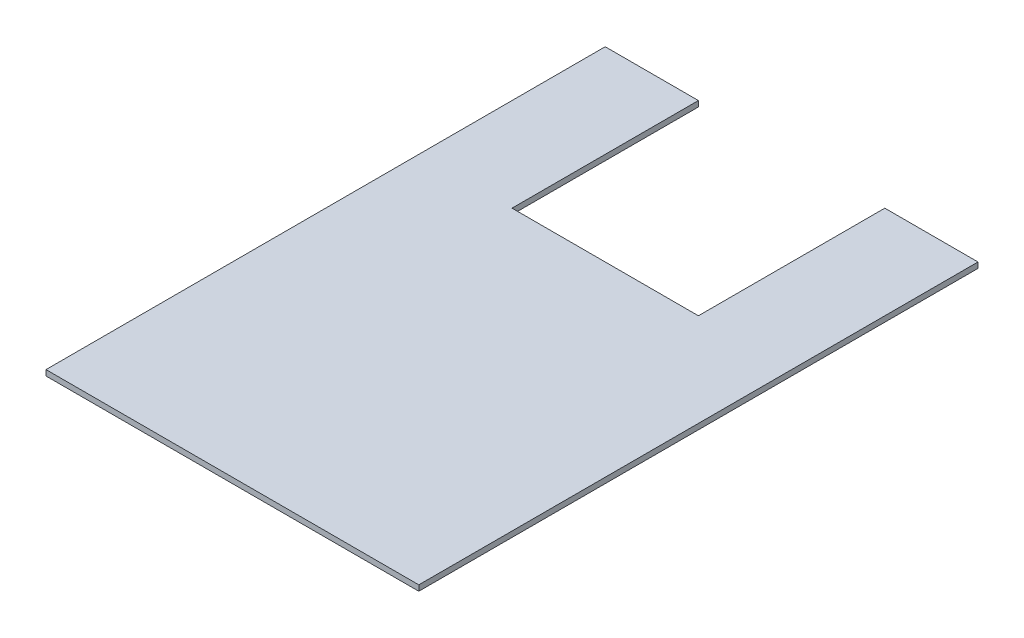
ISO-10303-21;
HEADER;
FILE_DESCRIPTION(('STEP AP214'),'2;1');
FILE_NAME('part.step','',(''),(''),'','','');
FILE_SCHEMA(('AUTOMOTIVE_DESIGN { 1 0 10303 214 1 1 1 1 }'));
ENDSEC;
DATA;
#1=APPLICATION_CONTEXT('core data for automotive mechanical design processes');
#2=APPLICATION_PROTOCOL_DEFINITION('international standard','automotive_design',2000,#1);
#3=PRODUCT_CONTEXT('',#1,'mechanical');
#4=PRODUCT('Part','Part','',(#3));
#5=PRODUCT_RELATED_PRODUCT_CATEGORY('part','',(#4));
#6=PRODUCT_DEFINITION_FORMATION('','',#4);
#7=PRODUCT_DEFINITION_CONTEXT('part definition',#1,'design');
#8=PRODUCT_DEFINITION('design','',#6,#7);
#9=PRODUCT_DEFINITION_SHAPE('','',#8);
#10=(LENGTH_UNIT() NAMED_UNIT(*) SI_UNIT(.MILLI.,.METRE.));
#11=(NAMED_UNIT(*) PLANE_ANGLE_UNIT() SI_UNIT($,.RADIAN.));
#12=(NAMED_UNIT(*) SI_UNIT($,.STERADIAN.) SOLID_ANGLE_UNIT());
#13=UNCERTAINTY_MEASURE_WITH_UNIT(LENGTH_MEASURE(1.E-05),#10,'distance_accuracy_value','');
#14=(GEOMETRIC_REPRESENTATION_CONTEXT(3) GLOBAL_UNCERTAINTY_ASSIGNED_CONTEXT((#13)) GLOBAL_UNIT_ASSIGNED_CONTEXT((#10,
#11,#12)) REPRESENTATION_CONTEXT('',''));
#15=CARTESIAN_POINT('',(0.,0.,0.));
#16=DIRECTION('',(0.,0.,1.));
#17=DIRECTION('',(1.,0.,0.));
#18=AXIS2_PLACEMENT_3D('',#15,#16,#17);
#19=CARTESIAN_POINT('',(-100.,3.,-150.));
#20=DIRECTION('',(0.,0.,1.));
#21=DIRECTION('',(1.,0.,0.));
#22=AXIS2_PLACEMENT_3D('',#19,#20,#21);
#23=PLANE('',#22);
#24=DIRECTION('',(0.,1.,0.));
#25=VECTOR('',#24,1.);
#26=CARTESIAN_POINT('',(50.,0.,-150.));
#27=LINE('',#26,#25);
#28=CARTESIAN_POINT('',(50.,0.,-150.));
#29=VERTEX_POINT('',#28);
#30=CARTESIAN_POINT('',(50.,3.,-150.));
#31=VERTEX_POINT('',#30);
#32=EDGE_CURVE('E107',#29,#31,#27,.T.);
#33=ORIENTED_EDGE('',*,*,#32,.T.);
#34=DIRECTION('',(-1.,0.,0.));
#35=VECTOR('',#34,1.);
#36=CARTESIAN_POINT('',(-100.,3.,-150.));
#37=LINE('',#36,#35);
#38=CARTESIAN_POINT('',(100.,3.,-150.));
#39=VERTEX_POINT('',#38);
#40=EDGE_CURVE('E86',#39,#31,#37,.T.);
#41=ORIENTED_EDGE('',*,*,#40,.F.);
#42=DIRECTION('',(0.,-1.,0.));
#43=VECTOR('',#42,1.);
#44=CARTESIAN_POINT('',(100.,3.,-150.));
#45=LINE('',#44,#43);
#46=CARTESIAN_POINT('',(100.,0.,-150.));
#47=VERTEX_POINT('',#46);
#48=EDGE_CURVE('E11',#39,#47,#45,.T.);
#49=ORIENTED_EDGE('',*,*,#48,.T.);
#50=DIRECTION('',(-1.,0.,0.));
#51=VECTOR('',#50,1.);
#52=CARTESIAN_POINT('',(-100.,0.,-150.));
#53=LINE('',#52,#51);
#54=EDGE_CURVE('E122',#47,#29,#53,.T.);
#55=ORIENTED_EDGE('',*,*,#54,.T.);
#56=EDGE_LOOP('',(#33,#41,#49,#55));
#57=FACE_BOUND('',#56,.T.);
#58=ADVANCED_FACE('F34',(#57),#23,.F.);
#59=DIRECTION('',(0.,1.,0.));
#60=VECTOR('',#59,1.);
#61=CARTESIAN_POINT('',(-50.,0.,-150.));
#62=LINE('',#61,#60);
#63=CARTESIAN_POINT('',(-50.,0.,-150.));
#64=VERTEX_POINT('',#63);
#65=CARTESIAN_POINT('',(-50.,3.,-150.));
#66=VERTEX_POINT('',#65);
#67=EDGE_CURVE('E162',#64,#66,#62,.T.);
#68=ORIENTED_EDGE('',*,*,#67,.F.);
#69=CARTESIAN_POINT('',(-100.,0.,-150.));
#70=VERTEX_POINT('',#69);
#71=EDGE_CURVE('E130',#64,#70,#53,.T.);
#72=ORIENTED_EDGE('',*,*,#71,.T.);
#73=DIRECTION('',(0.,-1.,0.));
#74=VECTOR('',#73,1.);
#75=CARTESIAN_POINT('',(-100.,3.,-150.));
#76=LINE('',#75,#74);
#77=CARTESIAN_POINT('',(-100.,3.,-150.));
#78=VERTEX_POINT('',#77);
#79=EDGE_CURVE('E42',#78,#70,#76,.T.);
#80=ORIENTED_EDGE('',*,*,#79,.F.);
#81=EDGE_CURVE('E158',#66,#78,#37,.T.);
#82=ORIENTED_EDGE('',*,*,#81,.F.);
#83=EDGE_LOOP('',(#68,#72,#80,#82));
#84=FACE_BOUND('',#83,.T.);
#85=ADVANCED_FACE('F177',(#84),#23,.F.);
#86=CARTESIAN_POINT('',(0.,3.,0.));
#87=DIRECTION('',(0.,1.,0.));
#88=DIRECTION('',(0.,0.,1.));
#89=AXIS2_PLACEMENT_3D('',#86,#87,#88);
#90=PLANE('',#89);
#91=ORIENTED_EDGE('',*,*,#40,.T.);
#92=DIRECTION('',(0.,0.,1.));
#93=VECTOR('',#92,1.);
#94=CARTESIAN_POINT('',(50.,3.,-150.));
#95=LINE('',#94,#93);
#96=CARTESIAN_POINT('',(50.,3.,-50.0000000000001));
#97=VERTEX_POINT('',#96);
#98=EDGE_CURVE('E113',#31,#97,#95,.T.);
#99=ORIENTED_EDGE('',*,*,#98,.T.);
#100=DIRECTION('',(-1.,0.,0.));
#101=VECTOR('',#100,1.);
#102=CARTESIAN_POINT('',(50.,3.,-50.0000000000001));
#103=LINE('',#102,#101);
#104=CARTESIAN_POINT('',(-50.,3.,-50.0000000000001));
#105=VERTEX_POINT('',#104);
#106=EDGE_CURVE('E167',#97,#105,#103,.T.);
#107=ORIENTED_EDGE('',*,*,#106,.T.);
#108=DIRECTION('',(0.,0.,-1.));
#109=VECTOR('',#108,1.);
#110=CARTESIAN_POINT('',(-50.,3.,-50.0000000000001));
#111=LINE('',#110,#109);
#112=EDGE_CURVE('E125',#105,#66,#111,.T.);
#113=ORIENTED_EDGE('',*,*,#112,.T.);
#114=ORIENTED_EDGE('',*,*,#81,.T.);
#115=DIRECTION('',(0.,0.,1.));
#116=VECTOR('',#115,1.);
#117=CARTESIAN_POINT('',(-100.,3.,-150.));
#118=LINE('',#117,#116);
#119=CARTESIAN_POINT('',(-100.,3.,150.));
#120=VERTEX_POINT('',#119);
#121=EDGE_CURVE('E148',#78,#120,#118,.T.);
#122=ORIENTED_EDGE('',*,*,#121,.T.);
#123=DIRECTION('',(1.,0.,0.));
#124=VECTOR('',#123,1.);
#125=CARTESIAN_POINT('',(-100.,3.,150.));
#126=LINE('',#125,#124);
#127=CARTESIAN_POINT('',(100.,3.,150.));
#128=VERTEX_POINT('',#127);
#129=EDGE_CURVE('E58',#120,#128,#126,.T.);
#130=ORIENTED_EDGE('',*,*,#129,.T.);
#131=DIRECTION('',(0.,0.,-1.));
#132=VECTOR('',#131,1.);
#133=CARTESIAN_POINT('',(100.,3.,-150.));
#134=LINE('',#133,#132);
#135=EDGE_CURVE('E137',#128,#39,#134,.T.);
#136=ORIENTED_EDGE('',*,*,#135,.T.);
#137=EDGE_LOOP('',(#91,#99,#107,#113,#114,#122,#130,#136));
#138=FACE_BOUND('',#137,.T.);
#139=ADVANCED_FACE('F178',(#138),#90,.T.);
#140=CARTESIAN_POINT('',(0.,0.,0.));
#141=DIRECTION('',(0.,1.,0.));
#142=DIRECTION('',(0.,0.,1.));
#143=AXIS2_PLACEMENT_3D('',#140,#141,#142);
#144=PLANE('',#143);
#145=DIRECTION('',(0.,0.,1.));
#146=VECTOR('',#145,1.);
#147=CARTESIAN_POINT('',(50.,0.,-150.));
#148=LINE('',#147,#146);
#149=CARTESIAN_POINT('',(50.,0.,-50.0000000000001));
#150=VERTEX_POINT('',#149);
#151=EDGE_CURVE('E110',#29,#150,#148,.T.);
#152=ORIENTED_EDGE('',*,*,#151,.F.);
#153=ORIENTED_EDGE('',*,*,#54,.F.);
#154=DIRECTION('',(0.,0.,-1.));
#155=VECTOR('',#154,1.);
#156=CARTESIAN_POINT('',(100.,0.,-150.));
#157=LINE('',#156,#155);
#158=CARTESIAN_POINT('',(100.,0.,150.));
#159=VERTEX_POINT('',#158);
#160=EDGE_CURVE('E115',#159,#47,#157,.T.);
#161=ORIENTED_EDGE('',*,*,#160,.F.);
#162=DIRECTION('',(1.,0.,0.));
#163=VECTOR('',#162,1.);
#164=CARTESIAN_POINT('',(-100.,0.,150.));
#165=LINE('',#164,#163);
#166=CARTESIAN_POINT('',(-100.,0.,150.));
#167=VERTEX_POINT('',#166);
#168=EDGE_CURVE('E79',#167,#159,#165,.T.);
#169=ORIENTED_EDGE('',*,*,#168,.F.);
#170=DIRECTION('',(0.,0.,1.));
#171=VECTOR('',#170,1.);
#172=CARTESIAN_POINT('',(-100.,0.,-150.));
#173=LINE('',#172,#171);
#174=EDGE_CURVE('E129',#70,#167,#173,.T.);
#175=ORIENTED_EDGE('',*,*,#174,.F.);
#176=ORIENTED_EDGE('',*,*,#71,.F.);
#177=DIRECTION('',(0.,0.,-1.));
#178=VECTOR('',#177,1.);
#179=CARTESIAN_POINT('',(-50.,0.,-50.0000000000001));
#180=LINE('',#179,#178);
#181=CARTESIAN_POINT('',(-50.,0.,-50.0000000000001));
#182=VERTEX_POINT('',#181);
#183=EDGE_CURVE('E164',#182,#64,#180,.T.);
#184=ORIENTED_EDGE('',*,*,#183,.F.);
#185=DIRECTION('',(-1.,0.,0.));
#186=VECTOR('',#185,1.);
#187=CARTESIAN_POINT('',(50.,0.,-50.0000000000001));
#188=LINE('',#187,#186);
#189=EDGE_CURVE('E124',#150,#182,#188,.T.);
#190=ORIENTED_EDGE('',*,*,#189,.F.);
#191=EDGE_LOOP('',(#152,#153,#161,#169,#175,#176,#184,#190));
#192=FACE_BOUND('',#191,.T.);
#193=ADVANCED_FACE('F120',(#192),#144,.F.);
#194=CARTESIAN_POINT('',(100.,3.,-150.));
#195=DIRECTION('',(-1.,0.,0.));
#196=DIRECTION('',(0.,0.,1.));
#197=AXIS2_PLACEMENT_3D('',#194,#195,#196);
#198=PLANE('',#197);
#199=ORIENTED_EDGE('',*,*,#160,.T.);
#200=ORIENTED_EDGE('',*,*,#48,.F.);
#201=ORIENTED_EDGE('',*,*,#135,.F.);
#202=DIRECTION('',(0.,-1.,0.));
#203=VECTOR('',#202,1.);
#204=CARTESIAN_POINT('',(100.,3.,150.));
#205=LINE('',#204,#203);
#206=EDGE_CURVE('E138',#128,#159,#205,.T.);
#207=ORIENTED_EDGE('',*,*,#206,.T.);
#208=EDGE_LOOP('',(#199,#200,#201,#207));
#209=FACE_BOUND('',#208,.T.);
#210=ADVANCED_FACE('F36',(#209),#198,.F.);
#211=CARTESIAN_POINT('',(-100.,3.,-150.));
#212=DIRECTION('',(1.,0.,0.));
#213=DIRECTION('',(0.,0.,-1.));
#214=AXIS2_PLACEMENT_3D('',#211,#212,#213);
#215=PLANE('',#214);
#216=ORIENTED_EDGE('',*,*,#174,.T.);
#217=DIRECTION('',(0.,-1.,0.));
#218=VECTOR('',#217,1.);
#219=CARTESIAN_POINT('',(-100.,3.,150.));
#220=LINE('',#219,#218);
#221=EDGE_CURVE('E140',#120,#167,#220,.T.);
#222=ORIENTED_EDGE('',*,*,#221,.F.);
#223=ORIENTED_EDGE('',*,*,#121,.F.);
#224=ORIENTED_EDGE('',*,*,#79,.T.);
#225=EDGE_LOOP('',(#216,#222,#223,#224));
#226=FACE_BOUND('',#225,.T.);
#227=ADVANCED_FACE('F146',(#226),#215,.F.);
#228=CARTESIAN_POINT('',(-100.,3.,150.));
#229=DIRECTION('',(0.,0.,-1.));
#230=DIRECTION('',(-1.,0.,0.));
#231=AXIS2_PLACEMENT_3D('',#228,#229,#230);
#232=PLANE('',#231);
#233=ORIENTED_EDGE('',*,*,#168,.T.);
#234=ORIENTED_EDGE('',*,*,#206,.F.);
#235=ORIENTED_EDGE('',*,*,#129,.F.);
#236=ORIENTED_EDGE('',*,*,#221,.T.);
#237=EDGE_LOOP('',(#233,#234,#235,#236));
#238=FACE_BOUND('',#237,.T.);
#239=ADVANCED_FACE('F154',(#238),#232,.F.);
#240=CARTESIAN_POINT('',(50.,0.,-150.));
#241=DIRECTION('',(-1.,0.,0.));
#242=DIRECTION('',(0.,0.,1.));
#243=AXIS2_PLACEMENT_3D('',#240,#241,#242);
#244=PLANE('',#243);
#245=ORIENTED_EDGE('',*,*,#98,.F.);
#246=ORIENTED_EDGE('',*,*,#32,.F.);
#247=ORIENTED_EDGE('',*,*,#151,.T.);
#248=DIRECTION('',(0.,1.,0.));
#249=VECTOR('',#248,1.);
#250=CARTESIAN_POINT('',(50.,0.,-50.0000000000001));
#251=LINE('',#250,#249);
#252=EDGE_CURVE('E116',#150,#97,#251,.T.);
#253=ORIENTED_EDGE('',*,*,#252,.T.);
#254=EDGE_LOOP('',(#245,#246,#247,#253));
#255=FACE_BOUND('',#254,.T.);
#256=ADVANCED_FACE('F109',(#255),#244,.T.);
#257=CARTESIAN_POINT('',(50.,0.,-50.0000000000001));
#258=DIRECTION('',(0.,0.,-1.));
#259=DIRECTION('',(-1.,0.,0.));
#260=AXIS2_PLACEMENT_3D('',#257,#258,#259);
#261=PLANE('',#260);
#262=ORIENTED_EDGE('',*,*,#106,.F.);
#263=ORIENTED_EDGE('',*,*,#252,.F.);
#264=ORIENTED_EDGE('',*,*,#189,.T.);
#265=DIRECTION('',(0.,1.,0.));
#266=VECTOR('',#265,1.);
#267=CARTESIAN_POINT('',(-50.,0.,-50.0000000000001));
#268=LINE('',#267,#266);
#269=EDGE_CURVE('E49',#182,#105,#268,.T.);
#270=ORIENTED_EDGE('',*,*,#269,.T.);
#271=EDGE_LOOP('',(#262,#263,#264,#270));
#272=FACE_BOUND('',#271,.T.);
#273=ADVANCED_FACE('F174',(#272),#261,.T.);
#274=CARTESIAN_POINT('',(-50.,0.,-50.0000000000001));
#275=DIRECTION('',(1.,0.,0.));
#276=DIRECTION('',(0.,0.,-1.));
#277=AXIS2_PLACEMENT_3D('',#274,#275,#276);
#278=PLANE('',#277);
#279=ORIENTED_EDGE('',*,*,#112,.F.);
#280=ORIENTED_EDGE('',*,*,#269,.F.);
#281=ORIENTED_EDGE('',*,*,#183,.T.);
#282=ORIENTED_EDGE('',*,*,#67,.T.);
#283=EDGE_LOOP('',(#279,#280,#281,#282));
#284=FACE_BOUND('',#283,.T.);
#285=ADVANCED_FACE('F176',(#284),#278,.T.);
#286=CLOSED_SHELL('',(#58,#85,#139,#193,#210,#227,#239,#256,#273,#285));
#287=MANIFOLD_SOLID_BREP('B2',#286);
#288=ADVANCED_BREP_SHAPE_REPRESENTATION('',(#18,#287),#14);
#289=SHAPE_DEFINITION_REPRESENTATION(#9,#288);
ENDSEC;
END-ISO-10303-21;
